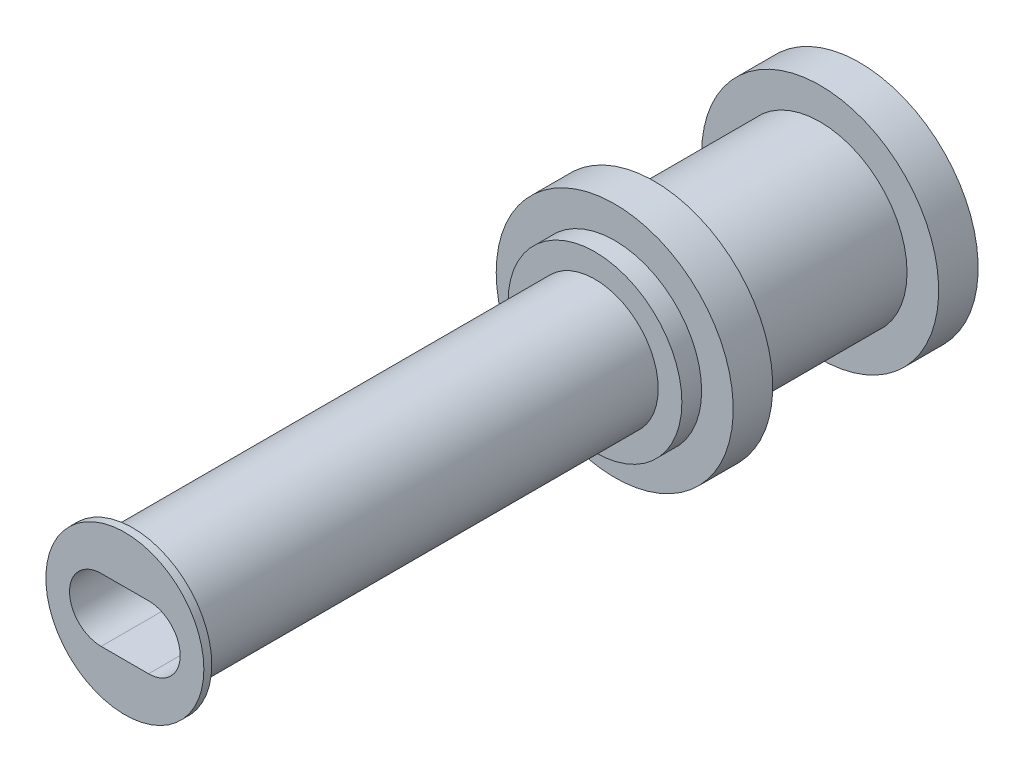
ISO-10303-21;
HEADER;
FILE_DESCRIPTION(('STEP AP214'),'2;1');
FILE_NAME('part.step','',(''),(''),'','','');
FILE_SCHEMA(('AUTOMOTIVE_DESIGN { 1 0 10303 214 1 1 1 1 }'));
ENDSEC;
DATA;
#1=APPLICATION_CONTEXT('core data for automotive mechanical design processes');
#2=APPLICATION_PROTOCOL_DEFINITION('international standard','automotive_design',2000,#1);
#3=PRODUCT_CONTEXT('',#1,'mechanical');
#4=PRODUCT('Part','Part','',(#3));
#5=PRODUCT_RELATED_PRODUCT_CATEGORY('part','',(#4));
#6=PRODUCT_DEFINITION_FORMATION('','',#4);
#7=PRODUCT_DEFINITION_CONTEXT('part definition',#1,'design');
#8=PRODUCT_DEFINITION('design','',#6,#7);
#9=PRODUCT_DEFINITION_SHAPE('','',#8);
#10=(LENGTH_UNIT() NAMED_UNIT(*) SI_UNIT(.MILLI.,.METRE.));
#11=(NAMED_UNIT(*) PLANE_ANGLE_UNIT() SI_UNIT($,.RADIAN.));
#12=(NAMED_UNIT(*) SI_UNIT($,.STERADIAN.) SOLID_ANGLE_UNIT());
#13=UNCERTAINTY_MEASURE_WITH_UNIT(LENGTH_MEASURE(1.E-05),#10,'distance_accuracy_value','');
#14=(GEOMETRIC_REPRESENTATION_CONTEXT(3) GLOBAL_UNCERTAINTY_ASSIGNED_CONTEXT((#13)) GLOBAL_UNIT_ASSIGNED_CONTEXT((#10,
#11,#12)) REPRESENTATION_CONTEXT('',''));
#15=CARTESIAN_POINT('',(0.,0.,0.));
#16=DIRECTION('',(0.,0.,1.));
#17=DIRECTION('',(1.,0.,0.));
#18=AXIS2_PLACEMENT_3D('',#15,#16,#17);
#19=CARTESIAN_POINT('',(7.874,0.,23.622));
#20=DIRECTION('',(0.,0.,-1.));
#21=DIRECTION('',(-1.,0.,0.));
#22=AXIS2_PLACEMENT_3D('',#19,#20,#21);
#23=CYLINDRICAL_SURFACE('',#22,2.032);
#24=CARTESIAN_POINT('',(7.874,0.,8.509));
#25=DIRECTION('',(0.,0.,1.));
#26=DIRECTION('',(1.,0.,0.));
#27=AXIS2_PLACEMENT_3D('',#24,#25,#26);
#28=CIRCLE('',#27,2.032);
#29=CARTESIAN_POINT('',(9.906,0.,8.509));
#30=VERTEX_POINT('',#29);
#31=EDGE_CURVE('E194',#30,#30,#28,.T.);
#32=ORIENTED_EDGE('',*,*,#31,.T.);
#33=EDGE_LOOP('',(#32));
#34=FACE_BOUND('',#33,.T.);
#35=CARTESIAN_POINT('',(7.874,0.,23.368));
#36=DIRECTION('',(0.,0.,1.));
#37=DIRECTION('',(1.,0.,0.));
#38=AXIS2_PLACEMENT_3D('',#35,#36,#37);
#39=CIRCLE('',#38,2.032);
#40=CARTESIAN_POINT('',(9.906,0.,23.368));
#41=VERTEX_POINT('',#40);
#42=EDGE_CURVE('E11',#41,#41,#39,.T.);
#43=ORIENTED_EDGE('',*,*,#42,.F.);
#44=EDGE_LOOP('',(#43));
#45=FACE_BOUND('',#44,.T.);
#46=ADVANCED_FACE('F38',(#34,#45),#23,.T.);
#47=CARTESIAN_POINT('',(7.874,0.,8.509));
#48=DIRECTION('',(0.,0.,1.));
#49=DIRECTION('',(1.,0.,0.));
#50=AXIS2_PLACEMENT_3D('',#47,#48,#49);
#51=PLANE('',#50);
#52=CARTESIAN_POINT('',(7.874,0.,8.509));
#53=DIRECTION('',(0.,0.,1.));
#54=DIRECTION('',(1.,0.,0.));
#55=AXIS2_PLACEMENT_3D('',#52,#53,#54);
#56=CIRCLE('',#55,2.794);
#57=CARTESIAN_POINT('',(10.668,0.,8.509));
#58=VERTEX_POINT('',#57);
#59=EDGE_CURVE('E199',#58,#58,#56,.T.);
#60=ORIENTED_EDGE('',*,*,#59,.T.);
#61=EDGE_LOOP('',(#60));
#62=FACE_BOUND('',#61,.T.);
#63=ORIENTED_EDGE('',*,*,#31,.F.);
#64=EDGE_LOOP('',(#63));
#65=FACE_BOUND('',#64,.T.);
#66=ADVANCED_FACE('F305',(#62,#65),#51,.T.);
#67=CARTESIAN_POINT('',(7.874,-6.28822135623731,7.874));
#68=DIRECTION('',(0.,0.,-1.));
#69=DIRECTION('',(1.,0.,0.));
#70=AXIS2_PLACEMENT_3D('',#67,#68,#69);
#71=PLANE('',#70);
#72=CARTESIAN_POINT('',(7.874,0.,7.874));
#73=DIRECTION('',(0.,0.,-1.));
#74=DIRECTION('',(-1.,0.,0.));
#75=AXIS2_PLACEMENT_3D('',#72,#73,#74);
#76=CIRCLE('',#75,3.81);
#77=CARTESIAN_POINT('',(4.064,0.,7.874));
#78=VERTEX_POINT('',#77);
#79=EDGE_CURVE('E202',#78,#78,#76,.T.);
#80=ORIENTED_EDGE('',*,*,#79,.F.);
#81=EDGE_LOOP('',(#80));
#82=FACE_BOUND('',#81,.T.);
#83=CARTESIAN_POINT('',(7.874,0.,7.874));
#84=DIRECTION('',(0.,0.,-1.));
#85=DIRECTION('',(-1.,0.,0.));
#86=AXIS2_PLACEMENT_3D('',#83,#84,#85);
#87=CIRCLE('',#86,2.794);
#88=CARTESIAN_POINT('',(5.08,0.,7.874));
#89=VERTEX_POINT('',#88);
#90=EDGE_CURVE('E46',#89,#89,#87,.F.);
#91=ORIENTED_EDGE('',*,*,#90,.F.);
#92=EDGE_LOOP('',(#91));
#93=FACE_BOUND('',#92,.T.);
#94=ADVANCED_FACE('F303',(#82,#93),#71,.F.);
#95=CARTESIAN_POINT('',(7.874,0.,3.937));
#96=DIRECTION('',(0.,0.,-1.));
#97=DIRECTION('',(-1.,0.,0.));
#98=AXIS2_PLACEMENT_3D('',#95,#96,#97);
#99=CYLINDRICAL_SURFACE('',#98,2.794);
#100=CARTESIAN_POINT('',(7.874,0.,1.27));
#101=DIRECTION('',(0.,0.,-1.));
#102=DIRECTION('',(-1.,0.,0.));
#103=AXIS2_PLACEMENT_3D('',#100,#101,#102);
#104=CIRCLE('',#103,2.794);
#105=CARTESIAN_POINT('',(5.08,0.,1.27));
#106=VERTEX_POINT('',#105);
#107=EDGE_CURVE('E293',#106,#106,#104,.T.);
#108=ORIENTED_EDGE('',*,*,#107,.F.);
#109=EDGE_LOOP('',(#108));
#110=FACE_BOUND('',#109,.T.);
#111=CARTESIAN_POINT('',(7.874,0.,6.604));
#112=DIRECTION('',(0.,0.,1.));
#113=DIRECTION('',(1.,0.,0.));
#114=AXIS2_PLACEMENT_3D('',#111,#112,#113);
#115=CIRCLE('',#114,2.794);
#116=CARTESIAN_POINT('',(10.668,0.,6.604));
#117=VERTEX_POINT('',#116);
#118=EDGE_CURVE('E296',#117,#117,#115,.T.);
#119=ORIENTED_EDGE('',*,*,#118,.F.);
#120=EDGE_LOOP('',(#119));
#121=FACE_BOUND('',#120,.T.);
#122=ADVANCED_FACE('F40',(#110,#121),#99,.T.);
#123=CARTESIAN_POINT('',(7.874,-1.524,3.937));
#124=DIRECTION('',(0.,0.,-1.));
#125=DIRECTION('',(-1.,0.,0.));
#126=AXIS2_PLACEMENT_3D('',#123,#124,#125);
#127=CYLINDRICAL_SURFACE('',#126,0.762000000000002);
#128=CARTESIAN_POINT('',(7.874,-1.524,0.));
#129=DIRECTION('',(0.,0.,1.));
#130=DIRECTION('',(1.,0.,0.));
#131=AXIS2_PLACEMENT_3D('',#128,#129,#130);
#132=CIRCLE('',#131,0.762000000000002);
#133=CARTESIAN_POINT('',(7.112,-1.524,0.));
#134=VERTEX_POINT('',#133);
#135=CARTESIAN_POINT('',(8.636,-1.524,0.));
#136=VERTEX_POINT('',#135);
#137=EDGE_CURVE('E238',#134,#136,#132,.T.);
#138=ORIENTED_EDGE('',*,*,#137,.F.);
#139=DIRECTION('',(0.,0.,-1.));
#140=VECTOR('',#139,1.);
#141=CARTESIAN_POINT('',(7.112,-1.524,3.937));
#142=LINE('',#141,#140);
#143=CARTESIAN_POINT('',(7.112,-1.524,7.874));
#144=VERTEX_POINT('',#143);
#145=EDGE_CURVE('E291',#144,#134,#142,.T.);
#146=ORIENTED_EDGE('',*,*,#145,.F.);
#147=CARTESIAN_POINT('',(7.874,-1.524,7.874));
#148=DIRECTION('',(0.,0.,1.));
#149=DIRECTION('',(1.,0.,0.));
#150=AXIS2_PLACEMENT_3D('',#147,#148,#149);
#151=CIRCLE('',#150,0.762000000000002);
#152=CARTESIAN_POINT('',(8.636,-1.524,7.874));
#153=VERTEX_POINT('',#152);
#154=EDGE_CURVE('E206',#144,#153,#151,.T.);
#155=ORIENTED_EDGE('',*,*,#154,.T.);
#156=DIRECTION('',(0.,0.,-1.));
#157=VECTOR('',#156,1.);
#158=CARTESIAN_POINT('',(8.636,-1.524,3.937));
#159=LINE('',#158,#157);
#160=EDGE_CURVE('E61',#153,#136,#159,.T.);
#161=ORIENTED_EDGE('',*,*,#160,.T.);
#162=EDGE_LOOP('',(#138,#146,#155,#161));
#163=FACE_BOUND('',#162,.T.);
#164=ADVANCED_FACE('F312',(#163),#127,.F.);
#165=CARTESIAN_POINT('',(7.112,-6.28822135623731,3.937));
#166=DIRECTION('',(1.,0.,0.));
#167=DIRECTION('',(0.,0.,-1.));
#168=AXIS2_PLACEMENT_3D('',#165,#166,#167);
#169=PLANE('',#168);
#170=DIRECTION('',(0.,-1.,0.));
#171=VECTOR('',#170,1.);
#172=CARTESIAN_POINT('',(7.112,-6.28822135623731,0.));
#173=LINE('',#172,#171);
#174=CARTESIAN_POINT('',(7.112,-0.762000000000001,0.));
#175=VERTEX_POINT('',#174);
#176=EDGE_CURVE('E244',#175,#134,#173,.T.);
#177=ORIENTED_EDGE('',*,*,#176,.F.);
#178=DIRECTION('',(0.,0.,-1.));
#179=VECTOR('',#178,1.);
#180=CARTESIAN_POINT('',(7.112,-0.762000000000001,3.937));
#181=LINE('',#180,#179);
#182=CARTESIAN_POINT('',(7.112,-0.762000000000001,7.874));
#183=VERTEX_POINT('',#182);
#184=EDGE_CURVE('E289',#183,#175,#181,.T.);
#185=ORIENTED_EDGE('',*,*,#184,.F.);
#186=DIRECTION('',(0.,-1.,0.));
#187=VECTOR('',#186,1.);
#188=CARTESIAN_POINT('',(7.112,-6.28822135623731,7.874));
#189=LINE('',#188,#187);
#190=EDGE_CURVE('E231',#183,#144,#189,.T.);
#191=ORIENTED_EDGE('',*,*,#190,.T.);
#192=ORIENTED_EDGE('',*,*,#145,.T.);
#193=EDGE_LOOP('',(#177,#185,#191,#192));
#194=FACE_BOUND('',#193,.T.);
#195=ADVANCED_FACE('F468',(#194),#169,.T.);
#196=CARTESIAN_POINT('',(7.874,-0.762000000000001,3.937));
#197=DIRECTION('',(0.,1.,0.));
#198=DIRECTION('',(-1.,0.,0.));
#199=AXIS2_PLACEMENT_3D('',#196,#197,#198);
#200=PLANE('',#199);
#201=DIRECTION('',(1.,0.,0.));
#202=VECTOR('',#201,1.);
#203=CARTESIAN_POINT('',(7.874,-0.762000000000001,0.));
#204=LINE('',#203,#202);
#205=CARTESIAN_POINT('',(6.35,-0.762000000000002,0.));
#206=VERTEX_POINT('',#205);
#207=EDGE_CURVE('E247',#206,#175,#204,.T.);
#208=ORIENTED_EDGE('',*,*,#207,.F.);
#209=DIRECTION('',(0.,0.,-1.));
#210=VECTOR('',#209,1.);
#211=CARTESIAN_POINT('',(6.35,-0.762000000000002,3.937));
#212=LINE('',#211,#210);
#213=CARTESIAN_POINT('',(6.35,-0.762000000000002,7.874));
#214=VERTEX_POINT('',#213);
#215=EDGE_CURVE('E287',#214,#206,#212,.T.);
#216=ORIENTED_EDGE('',*,*,#215,.F.);
#217=DIRECTION('',(1.,0.,0.));
#218=VECTOR('',#217,1.);
#219=CARTESIAN_POINT('',(7.874,-0.762000000000001,7.874));
#220=LINE('',#219,#218);
#221=EDGE_CURVE('E218',#214,#183,#220,.T.);
#222=ORIENTED_EDGE('',*,*,#221,.T.);
#223=ORIENTED_EDGE('',*,*,#184,.T.);
#224=EDGE_LOOP('',(#208,#216,#222,#223));
#225=FACE_BOUND('',#224,.T.);
#226=ADVANCED_FACE('F478',(#225),#200,.T.);
#227=CARTESIAN_POINT('',(6.35,0.,3.937));
#228=DIRECTION('',(0.,0.,-1.));
#229=DIRECTION('',(-1.,0.,0.));
#230=AXIS2_PLACEMENT_3D('',#227,#228,#229);
#231=CYLINDRICAL_SURFACE('',#230,0.762000000000002);
#232=CARTESIAN_POINT('',(6.35,0.,0.));
#233=DIRECTION('',(0.,0.,1.));
#234=DIRECTION('',(1.,0.,0.));
#235=AXIS2_PLACEMENT_3D('',#232,#233,#234);
#236=CIRCLE('',#235,0.762000000000002);
#237=CARTESIAN_POINT('',(6.35,0.762000000000001,0.));
#238=VERTEX_POINT('',#237);
#239=EDGE_CURVE('E251',#238,#206,#236,.T.);
#240=ORIENTED_EDGE('',*,*,#239,.F.);
#241=DIRECTION('',(0.,0.,-1.));
#242=VECTOR('',#241,1.);
#243=CARTESIAN_POINT('',(6.35,0.762000000000001,3.937));
#244=LINE('',#243,#242);
#245=CARTESIAN_POINT('',(6.35,0.762000000000001,7.874));
#246=VERTEX_POINT('',#245);
#247=EDGE_CURVE('E285',#246,#238,#244,.T.);
#248=ORIENTED_EDGE('',*,*,#247,.F.);
#249=CARTESIAN_POINT('',(6.35,0.,7.874));
#250=DIRECTION('',(0.,0.,1.));
#251=DIRECTION('',(1.,0.,0.));
#252=AXIS2_PLACEMENT_3D('',#249,#250,#251);
#253=CIRCLE('',#252,0.762000000000002);
#254=EDGE_CURVE('E232',#246,#214,#253,.T.);
#255=ORIENTED_EDGE('',*,*,#254,.T.);
#256=ORIENTED_EDGE('',*,*,#215,.T.);
#257=EDGE_LOOP('',(#240,#248,#255,#256));
#258=FACE_BOUND('',#257,.T.);
#259=ADVANCED_FACE('F490',(#258),#231,.F.);
#260=CARTESIAN_POINT('',(7.874,0.762000000000001,3.937));
#261=DIRECTION('',(0.,1.,0.));
#262=DIRECTION('',(-1.,0.,0.));
#263=AXIS2_PLACEMENT_3D('',#260,#261,#262);
#264=PLANE('',#263);
#265=DIRECTION('',(1.,0.,0.));
#266=VECTOR('',#265,1.);
#267=CARTESIAN_POINT('',(7.874,0.762000000000001,0.));
#268=LINE('',#267,#266);
#269=CARTESIAN_POINT('',(7.112,0.762000000000001,0.));
#270=VERTEX_POINT('',#269);
#271=EDGE_CURVE('E255',#238,#270,#268,.T.);
#272=ORIENTED_EDGE('',*,*,#271,.T.);
#273=DIRECTION('',(0.,0.,-1.));
#274=VECTOR('',#273,1.);
#275=CARTESIAN_POINT('',(7.112,0.762000000000001,3.937));
#276=LINE('',#275,#274);
#277=CARTESIAN_POINT('',(7.112,0.762000000000001,7.874));
#278=VERTEX_POINT('',#277);
#279=EDGE_CURVE('E283',#278,#270,#276,.T.);
#280=ORIENTED_EDGE('',*,*,#279,.F.);
#281=DIRECTION('',(1.,0.,0.));
#282=VECTOR('',#281,1.);
#283=CARTESIAN_POINT('',(7.874,0.762000000000001,7.874));
#284=LINE('',#283,#282);
#285=EDGE_CURVE('E224',#246,#278,#284,.T.);
#286=ORIENTED_EDGE('',*,*,#285,.F.);
#287=ORIENTED_EDGE('',*,*,#247,.T.);
#288=EDGE_LOOP('',(#272,#280,#286,#287));
#289=FACE_BOUND('',#288,.T.);
#290=ADVANCED_FACE('F502',(#289),#264,.F.);
#291=CARTESIAN_POINT('',(7.112,1.524,0.));
#292=VERTEX_POINT('',#291);
#293=EDGE_CURVE('E248',#292,#270,#173,.T.);
#294=ORIENTED_EDGE('',*,*,#293,.F.);
#295=DIRECTION('',(0.,0.,-1.));
#296=VECTOR('',#295,1.);
#297=CARTESIAN_POINT('',(7.112,1.524,3.937));
#298=LINE('',#297,#296);
#299=CARTESIAN_POINT('',(7.112,1.524,7.874));
#300=VERTEX_POINT('',#299);
#301=EDGE_CURVE('E281',#300,#292,#298,.T.);
#302=ORIENTED_EDGE('',*,*,#301,.F.);
#303=EDGE_CURVE('E228',#300,#278,#189,.T.);
#304=ORIENTED_EDGE('',*,*,#303,.T.);
#305=ORIENTED_EDGE('',*,*,#279,.T.);
#306=EDGE_LOOP('',(#294,#302,#304,#305));
#307=FACE_BOUND('',#306,.T.);
#308=ADVANCED_FACE('F481',(#307),#169,.T.);
#309=CARTESIAN_POINT('',(7.874,1.524,3.937));
#310=DIRECTION('',(0.,0.,-1.));
#311=DIRECTION('',(-1.,0.,0.));
#312=AXIS2_PLACEMENT_3D('',#309,#310,#311);
#313=CYLINDRICAL_SURFACE('',#312,0.762000000000002);
#314=CARTESIAN_POINT('',(7.874,1.524,0.));
#315=DIRECTION('',(0.,0.,1.));
#316=DIRECTION('',(1.,0.,0.));
#317=AXIS2_PLACEMENT_3D('',#314,#315,#316);
#318=CIRCLE('',#317,0.762000000000002);
#319=CARTESIAN_POINT('',(8.636,1.524,0.));
#320=VERTEX_POINT('',#319);
#321=EDGE_CURVE('E259',#320,#292,#318,.T.);
#322=ORIENTED_EDGE('',*,*,#321,.F.);
#323=DIRECTION('',(0.,0.,-1.));
#324=VECTOR('',#323,1.);
#325=CARTESIAN_POINT('',(8.636,1.524,3.937));
#326=LINE('',#325,#324);
#327=CARTESIAN_POINT('',(8.636,1.524,7.874));
#328=VERTEX_POINT('',#327);
#329=EDGE_CURVE('E279',#328,#320,#326,.T.);
#330=ORIENTED_EDGE('',*,*,#329,.F.);
#331=CARTESIAN_POINT('',(7.874,1.524,7.874));
#332=DIRECTION('',(0.,0.,1.));
#333=DIRECTION('',(1.,0.,0.));
#334=AXIS2_PLACEMENT_3D('',#331,#332,#333);
#335=CIRCLE('',#334,0.762000000000002);
#336=EDGE_CURVE('E225',#328,#300,#335,.T.);
#337=ORIENTED_EDGE('',*,*,#336,.T.);
#338=ORIENTED_EDGE('',*,*,#301,.T.);
#339=EDGE_LOOP('',(#322,#330,#337,#338));
#340=FACE_BOUND('',#339,.T.);
#341=ADVANCED_FACE('F524',(#340),#313,.F.);
#342=CARTESIAN_POINT('',(8.636,-6.28822135623731,3.937));
#343=DIRECTION('',(1.,0.,0.));
#344=DIRECTION('',(0.,0.,-1.));
#345=AXIS2_PLACEMENT_3D('',#342,#343,#344);
#346=PLANE('',#345);
#347=DIRECTION('',(0.,-1.,0.));
#348=VECTOR('',#347,1.);
#349=CARTESIAN_POINT('',(8.636,-6.28822135623731,0.));
#350=LINE('',#349,#348);
#351=CARTESIAN_POINT('',(8.636,0.762000000000001,0.));
#352=VERTEX_POINT('',#351);
#353=EDGE_CURVE('E262',#320,#352,#350,.T.);
#354=ORIENTED_EDGE('',*,*,#353,.T.);
#355=DIRECTION('',(0.,0.,-1.));
#356=VECTOR('',#355,1.);
#357=CARTESIAN_POINT('',(8.636,0.762000000000001,3.937));
#358=LINE('',#357,#356);
#359=CARTESIAN_POINT('',(8.636,0.762000000000001,7.874));
#360=VERTEX_POINT('',#359);
#361=EDGE_CURVE('E276',#360,#352,#358,.T.);
#362=ORIENTED_EDGE('',*,*,#361,.F.);
#363=DIRECTION('',(0.,-1.,0.));
#364=VECTOR('',#363,1.);
#365=CARTESIAN_POINT('',(8.636,-6.28822135623731,7.874));
#366=LINE('',#365,#364);
#367=EDGE_CURVE('E214',#328,#360,#366,.T.);
#368=ORIENTED_EDGE('',*,*,#367,.F.);
#369=ORIENTED_EDGE('',*,*,#329,.T.);
#370=EDGE_LOOP('',(#354,#362,#368,#369));
#371=FACE_BOUND('',#370,.T.);
#372=ADVANCED_FACE('F534',(#371),#346,.F.);
#373=CARTESIAN_POINT('',(9.398,0.762000000000002,0.));
#374=VERTEX_POINT('',#373);
#375=EDGE_CURVE('E258',#352,#374,#268,.T.);
#376=ORIENTED_EDGE('',*,*,#375,.T.);
#377=DIRECTION('',(0.,0.,-1.));
#378=VECTOR('',#377,1.);
#379=CARTESIAN_POINT('',(9.398,0.762000000000002,3.937));
#380=LINE('',#379,#378);
#381=CARTESIAN_POINT('',(9.398,0.762000000000002,7.874));
#382=VERTEX_POINT('',#381);
#383=EDGE_CURVE('E274',#382,#374,#380,.T.);
#384=ORIENTED_EDGE('',*,*,#383,.F.);
#385=EDGE_CURVE('E221',#360,#382,#284,.T.);
#386=ORIENTED_EDGE('',*,*,#385,.F.);
#387=ORIENTED_EDGE('',*,*,#361,.T.);
#388=EDGE_LOOP('',(#376,#384,#386,#387));
#389=FACE_BOUND('',#388,.T.);
#390=ADVANCED_FACE('F515',(#389),#264,.F.);
#391=CARTESIAN_POINT('',(9.398,0.,3.937));
#392=DIRECTION('',(0.,0.,-1.));
#393=DIRECTION('',(-1.,0.,0.));
#394=AXIS2_PLACEMENT_3D('',#391,#392,#393);
#395=CYLINDRICAL_SURFACE('',#394,0.762000000000002);
#396=CARTESIAN_POINT('',(9.398,0.,0.));
#397=DIRECTION('',(0.,0.,1.));
#398=DIRECTION('',(1.,0.,0.));
#399=AXIS2_PLACEMENT_3D('',#396,#397,#398);
#400=CIRCLE('',#399,0.762000000000002);
#401=CARTESIAN_POINT('',(9.398,-0.762000000000001,0.));
#402=VERTEX_POINT('',#401);
#403=EDGE_CURVE('E266',#402,#374,#400,.T.);
#404=ORIENTED_EDGE('',*,*,#403,.F.);
#405=DIRECTION('',(0.,0.,-1.));
#406=VECTOR('',#405,1.);
#407=CARTESIAN_POINT('',(9.398,-0.762000000000001,3.937));
#408=LINE('',#407,#406);
#409=CARTESIAN_POINT('',(9.398,-0.762000000000001,7.874));
#410=VERTEX_POINT('',#409);
#411=EDGE_CURVE('E272',#410,#402,#408,.T.);
#412=ORIENTED_EDGE('',*,*,#411,.F.);
#413=CARTESIAN_POINT('',(9.398,0.,7.874));
#414=DIRECTION('',(0.,0.,1.));
#415=DIRECTION('',(1.,0.,0.));
#416=AXIS2_PLACEMENT_3D('',#413,#414,#415);
#417=CIRCLE('',#416,0.762000000000002);
#418=EDGE_CURVE('E217',#410,#382,#417,.T.);
#419=ORIENTED_EDGE('',*,*,#418,.T.);
#420=ORIENTED_EDGE('',*,*,#383,.T.);
#421=EDGE_LOOP('',(#404,#412,#419,#420));
#422=FACE_BOUND('',#421,.T.);
#423=ADVANCED_FACE('F556',(#422),#395,.F.);
#424=CARTESIAN_POINT('',(8.636,-0.762000000000001,0.));
#425=VERTEX_POINT('',#424);
#426=EDGE_CURVE('E252',#425,#402,#204,.T.);
#427=ORIENTED_EDGE('',*,*,#426,.F.);
#428=DIRECTION('',(0.,0.,-1.));
#429=VECTOR('',#428,1.);
#430=CARTESIAN_POINT('',(8.636,-0.762000000000001,3.937));
#431=LINE('',#430,#429);
#432=CARTESIAN_POINT('',(8.636,-0.762000000000001,7.874));
#433=VERTEX_POINT('',#432);
#434=EDGE_CURVE('E270',#433,#425,#431,.T.);
#435=ORIENTED_EDGE('',*,*,#434,.F.);
#436=EDGE_CURVE('E213',#433,#410,#220,.T.);
#437=ORIENTED_EDGE('',*,*,#436,.T.);
#438=ORIENTED_EDGE('',*,*,#411,.T.);
#439=EDGE_LOOP('',(#427,#435,#437,#438));
#440=FACE_BOUND('',#439,.T.);
#441=ADVANCED_FACE('F493',(#440),#200,.T.);
#442=EDGE_CURVE('E265',#425,#136,#350,.T.);
#443=ORIENTED_EDGE('',*,*,#442,.T.);
#444=ORIENTED_EDGE('',*,*,#160,.F.);
#445=EDGE_CURVE('E210',#433,#153,#366,.T.);
#446=ORIENTED_EDGE('',*,*,#445,.F.);
#447=ORIENTED_EDGE('',*,*,#434,.T.);
#448=EDGE_LOOP('',(#443,#444,#446,#447));
#449=FACE_BOUND('',#448,.T.);
#450=ADVANCED_FACE('F547',(#449),#346,.F.);
#451=CARTESIAN_POINT('',(7.874,-6.28822135623731,0.));
#452=DIRECTION('',(0.,0.,1.));
#453=DIRECTION('',(1.,0.,0.));
#454=AXIS2_PLACEMENT_3D('',#451,#452,#453);
#455=PLANE('',#454);
#456=ORIENTED_EDGE('',*,*,#137,.T.);
#457=ORIENTED_EDGE('',*,*,#442,.F.);
#458=ORIENTED_EDGE('',*,*,#426,.T.);
#459=ORIENTED_EDGE('',*,*,#403,.T.);
#460=ORIENTED_EDGE('',*,*,#375,.F.);
#461=ORIENTED_EDGE('',*,*,#353,.F.);
#462=ORIENTED_EDGE('',*,*,#321,.T.);
#463=ORIENTED_EDGE('',*,*,#293,.T.);
#464=ORIENTED_EDGE('',*,*,#271,.F.);
#465=ORIENTED_EDGE('',*,*,#239,.T.);
#466=ORIENTED_EDGE('',*,*,#207,.T.);
#467=ORIENTED_EDGE('',*,*,#176,.T.);
#468=EDGE_LOOP('',(#456,#457,#458,#459,#460,#461,#462,#463,#464,#465,#466,#467));
#469=FACE_BOUND('',#468,.T.);
#470=CARTESIAN_POINT('',(7.874,0.,0.));
#471=DIRECTION('',(0.,0.,-1.));
#472=DIRECTION('',(-1.,0.,0.));
#473=AXIS2_PLACEMENT_3D('',#470,#471,#472);
#474=CIRCLE('',#473,3.81);
#475=CARTESIAN_POINT('',(4.064,0.,0.));
#476=VERTEX_POINT('',#475);
#477=EDGE_CURVE('E239',#476,#476,#474,.T.);
#478=ORIENTED_EDGE('',*,*,#477,.T.);
#479=EDGE_LOOP('',(#478));
#480=FACE_BOUND('',#479,.T.);
#481=ADVANCED_FACE('F583',(#469,#480),#455,.F.);
#482=CARTESIAN_POINT('',(7.874,0.,1.27));
#483=DIRECTION('',(0.,0.,-1.));
#484=DIRECTION('',(-1.,0.,0.));
#485=AXIS2_PLACEMENT_3D('',#482,#483,#484);
#486=CYLINDRICAL_SURFACE('',#485,3.81);
#487=CARTESIAN_POINT('',(7.874,0.,1.27));
#488=DIRECTION('',(0.,0.,-1.));
#489=DIRECTION('',(-1.,0.,0.));
#490=AXIS2_PLACEMENT_3D('',#487,#488,#489);
#491=CIRCLE('',#490,3.81);
#492=CARTESIAN_POINT('',(4.064,0.,1.27));
#493=VERTEX_POINT('',#492);
#494=EDGE_CURVE('E235',#493,#493,#491,.T.);
#495=ORIENTED_EDGE('',*,*,#494,.T.);
#496=EDGE_LOOP('',(#495));
#497=FACE_BOUND('',#496,.T.);
#498=ORIENTED_EDGE('',*,*,#477,.F.);
#499=EDGE_LOOP('',(#498));
#500=FACE_BOUND('',#499,.T.);
#501=ADVANCED_FACE('F594',(#497,#500),#486,.T.);
#502=CARTESIAN_POINT('',(7.874,0.,1.27));
#503=DIRECTION('',(0.,0.,-1.));
#504=DIRECTION('',(-1.,0.,0.));
#505=AXIS2_PLACEMENT_3D('',#502,#503,#504);
#506=PLANE('',#505);
#507=ORIENTED_EDGE('',*,*,#107,.T.);
#508=EDGE_LOOP('',(#507));
#509=FACE_BOUND('',#508,.T.);
#510=ORIENTED_EDGE('',*,*,#494,.F.);
#511=EDGE_LOOP('',(#510));
#512=FACE_BOUND('',#511,.T.);
#513=ADVANCED_FACE('F340',(#509,#512),#506,.F.);
#514=CARTESIAN_POINT('',(7.874,0.,6.604));
#515=DIRECTION('',(0.,0.,1.));
#516=DIRECTION('',(-1.,0.,0.));
#517=AXIS2_PLACEMENT_3D('',#514,#515,#516);
#518=PLANE('',#517);
#519=CARTESIAN_POINT('',(7.874,0.,6.604));
#520=DIRECTION('',(0.,0.,-1.));
#521=DIRECTION('',(-1.,0.,0.));
#522=AXIS2_PLACEMENT_3D('',#519,#520,#521);
#523=CIRCLE('',#522,3.81);
#524=CARTESIAN_POINT('',(4.064,0.,6.604));
#525=VERTEX_POINT('',#524);
#526=EDGE_CURVE('E203',#525,#525,#523,.T.);
#527=ORIENTED_EDGE('',*,*,#526,.T.);
#528=EDGE_LOOP('',(#527));
#529=FACE_BOUND('',#528,.T.);
#530=ORIENTED_EDGE('',*,*,#118,.T.);
#531=EDGE_LOOP('',(#530));
#532=FACE_BOUND('',#531,.T.);
#533=ADVANCED_FACE('F338',(#529,#532),#518,.F.);
#534=CARTESIAN_POINT('',(7.874,0.,6.604));
#535=DIRECTION('',(0.,0.,1.));
#536=DIRECTION('',(1.,0.,0.));
#537=AXIS2_PLACEMENT_3D('',#534,#535,#536);
#538=CYLINDRICAL_SURFACE('',#537,3.81);
#539=ORIENTED_EDGE('',*,*,#526,.F.);
#540=EDGE_LOOP('',(#539));
#541=FACE_BOUND('',#540,.T.);
#542=ORIENTED_EDGE('',*,*,#79,.T.);
#543=EDGE_LOOP('',(#542));
#544=FACE_BOUND('',#543,.T.);
#545=ADVANCED_FACE('F336',(#541,#544),#538,.T.);
#546=CARTESIAN_POINT('',(7.874,0.,8.509));
#547=DIRECTION('',(0.,0.,-1.));
#548=DIRECTION('',(-1.,0.,0.));
#549=AXIS2_PLACEMENT_3D('',#546,#547,#548);
#550=CYLINDRICAL_SURFACE('',#549,2.794);
#551=ORIENTED_EDGE('',*,*,#59,.F.);
#552=EDGE_LOOP('',(#551));
#553=FACE_BOUND('',#552,.T.);
#554=ORIENTED_EDGE('',*,*,#90,.T.);
#555=EDGE_LOOP('',(#554));
#556=FACE_BOUND('',#555,.T.);
#557=ADVANCED_FACE('F301',(#553,#556),#550,.T.);
#558=CARTESIAN_POINT('',(7.874,0.,7.874));
#559=DIRECTION('',(0.,0.,1.));
#560=DIRECTION('',(1.,0.,0.));
#561=AXIS2_PLACEMENT_3D('',#558,#559,#560);
#562=PLANE('',#561);
#563=ORIENTED_EDGE('',*,*,#154,.F.);
#564=ORIENTED_EDGE('',*,*,#190,.F.);
#565=ORIENTED_EDGE('',*,*,#221,.F.);
#566=ORIENTED_EDGE('',*,*,#254,.F.);
#567=ORIENTED_EDGE('',*,*,#285,.T.);
#568=ORIENTED_EDGE('',*,*,#303,.F.);
#569=ORIENTED_EDGE('',*,*,#336,.F.);
#570=ORIENTED_EDGE('',*,*,#367,.T.);
#571=ORIENTED_EDGE('',*,*,#385,.T.);
#572=ORIENTED_EDGE('',*,*,#418,.F.);
#573=ORIENTED_EDGE('',*,*,#436,.F.);
#574=ORIENTED_EDGE('',*,*,#445,.T.);
#575=EDGE_LOOP('',(#563,#564,#565,#566,#567,#568,#569,#570,#571,#572,#573,#574));
#576=FACE_BOUND('',#575,.T.);
#577=ADVANCED_FACE('F329',(#576),#562,.F.);
#578=CARTESIAN_POINT('',(7.874,0.,23.368));
#579=DIRECTION('',(0.,0.,1.));
#580=DIRECTION('',(1.,0.,0.));
#581=AXIS2_PLACEMENT_3D('',#578,#579,#580);
#582=CYLINDRICAL_SURFACE('',#581,2.54);
#583=CARTESIAN_POINT('',(7.874,0.,23.368));
#584=DIRECTION('',(0.,0.,1.));
#585=DIRECTION('',(1.,0.,0.));
#586=AXIS2_PLACEMENT_3D('',#583,#584,#585);
#587=CIRCLE('',#586,2.54);
#588=CARTESIAN_POINT('',(10.414,0.,23.368));
#589=VERTEX_POINT('',#588);
#590=EDGE_CURVE('E191',#589,#589,#587,.T.);
#591=ORIENTED_EDGE('',*,*,#590,.T.);
#592=EDGE_LOOP('',(#591));
#593=FACE_BOUND('',#592,.T.);
#594=CARTESIAN_POINT('',(7.874,0.,23.622));
#595=DIRECTION('',(0.,0.,1.));
#596=DIRECTION('',(1.,0.,0.));
#597=AXIS2_PLACEMENT_3D('',#594,#595,#596);
#598=CIRCLE('',#597,2.54);
#599=CARTESIAN_POINT('',(10.414,0.,23.622));
#600=VERTEX_POINT('',#599);
#601=EDGE_CURVE('E187',#600,#600,#598,.T.);
#602=ORIENTED_EDGE('',*,*,#601,.F.);
#603=EDGE_LOOP('',(#602));
#604=FACE_BOUND('',#603,.T.);
#605=ADVANCED_FACE('F332',(#593,#604),#582,.T.);
#606=CARTESIAN_POINT('',(7.874,0.,23.368));
#607=DIRECTION('',(0.,0.,1.));
#608=DIRECTION('',(1.,0.,0.));
#609=AXIS2_PLACEMENT_3D('',#606,#607,#608);
#610=PLANE('',#609);
#611=ORIENTED_EDGE('',*,*,#42,.T.);
#612=EDGE_LOOP('',(#611));
#613=FACE_BOUND('',#612,.T.);
#614=ORIENTED_EDGE('',*,*,#590,.F.);
#615=EDGE_LOOP('',(#614));
#616=FACE_BOUND('',#615,.T.);
#617=ADVANCED_FACE('F370',(#613,#616),#610,.F.);
#618=CARTESIAN_POINT('',(7.874,0.,23.622));
#619=DIRECTION('',(0.,0.,1.));
#620=DIRECTION('',(1.,0.,0.));
#621=AXIS2_PLACEMENT_3D('',#618,#619,#620);
#622=PLANE('',#621);
#623=CARTESIAN_POINT('',(8.636,0.,23.622));
#624=DIRECTION('',(0.,0.,1.));
#625=DIRECTION('',(1.,0.,0.));
#626=AXIS2_PLACEMENT_3D('',#623,#624,#625);
#627=CIRCLE('',#626,1.016);
#628=CARTESIAN_POINT('',(8.636,-1.016,23.622));
#629=VERTEX_POINT('',#628);
#630=CARTESIAN_POINT('',(8.636,1.016,23.622));
#631=VERTEX_POINT('',#630);
#632=EDGE_CURVE('E53',#629,#631,#627,.T.);
#633=ORIENTED_EDGE('',*,*,#632,.F.);
#634=DIRECTION('',(1.,0.,0.));
#635=VECTOR('',#634,1.);
#636=CARTESIAN_POINT('',(8.636,-1.016,23.622));
#637=LINE('',#636,#635);
#638=CARTESIAN_POINT('',(7.112,-1.016,23.622));
#639=VERTEX_POINT('',#638);
#640=EDGE_CURVE('E172',#639,#629,#637,.T.);
#641=ORIENTED_EDGE('',*,*,#640,.F.);
#642=CARTESIAN_POINT('',(7.112,0.,23.622));
#643=DIRECTION('',(0.,0.,1.));
#644=DIRECTION('',(1.,0.,0.));
#645=AXIS2_PLACEMENT_3D('',#642,#643,#644);
#646=CIRCLE('',#645,1.016);
#647=CARTESIAN_POINT('',(7.112,1.016,23.622));
#648=VERTEX_POINT('',#647);
#649=EDGE_CURVE('E175',#648,#639,#646,.T.);
#650=ORIENTED_EDGE('',*,*,#649,.F.);
#651=DIRECTION('',(-1.,0.,0.));
#652=VECTOR('',#651,1.);
#653=CARTESIAN_POINT('',(8.636,1.016,23.622));
#654=LINE('',#653,#652);
#655=EDGE_CURVE('E181',#631,#648,#654,.T.);
#656=ORIENTED_EDGE('',*,*,#655,.F.);
#657=EDGE_LOOP('',(#633,#641,#650,#656));
#658=FACE_BOUND('',#657,.T.);
#659=ORIENTED_EDGE('',*,*,#601,.T.);
#660=EDGE_LOOP('',(#659));
#661=FACE_BOUND('',#660,.T.);
#662=ADVANCED_FACE('F326',(#658,#661),#622,.T.);
#663=CARTESIAN_POINT('',(8.636,0.,8.382));
#664=DIRECTION('',(0.,0.,1.));
#665=DIRECTION('',(1.,0.,0.));
#666=AXIS2_PLACEMENT_3D('',#663,#664,#665);
#667=CYLINDRICAL_SURFACE('',#666,1.016);
#668=ORIENTED_EDGE('',*,*,#632,.T.);
#669=DIRECTION('',(0.,0.,1.));
#670=VECTOR('',#669,1.);
#671=CARTESIAN_POINT('',(8.636,1.016,8.382));
#672=LINE('',#671,#670);
#673=CARTESIAN_POINT('',(8.636,1.016,8.382));
#674=VERTEX_POINT('',#673);
#675=EDGE_CURVE('E150',#674,#631,#672,.T.);
#676=ORIENTED_EDGE('',*,*,#675,.F.);
#677=CARTESIAN_POINT('',(8.636,0.,8.382));
#678=DIRECTION('',(0.,0.,1.));
#679=DIRECTION('',(1.,0.,0.));
#680=AXIS2_PLACEMENT_3D('',#677,#678,#679);
#681=CIRCLE('',#680,1.016);
#682=CARTESIAN_POINT('',(8.636,-1.016,8.382));
#683=VERTEX_POINT('',#682);
#684=EDGE_CURVE('E154',#683,#674,#681,.T.);
#685=ORIENTED_EDGE('',*,*,#684,.F.);
#686=DIRECTION('',(0.,0.,1.));
#687=VECTOR('',#686,1.);
#688=CARTESIAN_POINT('',(8.636,-1.016,8.382));
#689=LINE('',#688,#687);
#690=EDGE_CURVE('E185',#683,#629,#689,.T.);
#691=ORIENTED_EDGE('',*,*,#690,.T.);
#692=EDGE_LOOP('',(#668,#676,#685,#691));
#693=FACE_BOUND('',#692,.T.);
#694=ADVANCED_FACE('F152',(#693),#667,.F.);
#695=CARTESIAN_POINT('',(8.636,-1.016,8.382));
#696=DIRECTION('',(0.,-1.,0.));
#697=DIRECTION('',(1.,0.,0.));
#698=AXIS2_PLACEMENT_3D('',#695,#696,#697);
#699=PLANE('',#698);
#700=ORIENTED_EDGE('',*,*,#640,.T.);
#701=ORIENTED_EDGE('',*,*,#690,.F.);
#702=DIRECTION('',(1.,0.,0.));
#703=VECTOR('',#702,1.);
#704=CARTESIAN_POINT('',(8.636,-1.016,8.382));
#705=LINE('',#704,#703);
#706=CARTESIAN_POINT('',(7.112,-1.016,8.382));
#707=VERTEX_POINT('',#706);
#708=EDGE_CURVE('E160',#707,#683,#705,.T.);
#709=ORIENTED_EDGE('',*,*,#708,.F.);
#710=DIRECTION('',(0.,0.,1.));
#711=VECTOR('',#710,1.);
#712=CARTESIAN_POINT('',(7.112,-1.016,8.382));
#713=LINE('',#712,#711);
#714=EDGE_CURVE('E188',#707,#639,#713,.T.);
#715=ORIENTED_EDGE('',*,*,#714,.T.);
#716=EDGE_LOOP('',(#700,#701,#709,#715));
#717=FACE_BOUND('',#716,.T.);
#718=ADVANCED_FACE('F390',(#717),#699,.F.);
#719=CARTESIAN_POINT('',(7.112,0.,8.382));
#720=DIRECTION('',(0.,0.,1.));
#721=DIRECTION('',(1.,0.,0.));
#722=AXIS2_PLACEMENT_3D('',#719,#720,#721);
#723=CYLINDRICAL_SURFACE('',#722,1.016);
#724=ORIENTED_EDGE('',*,*,#649,.T.);
#725=ORIENTED_EDGE('',*,*,#714,.F.);
#726=CARTESIAN_POINT('',(7.112,0.,8.382));
#727=DIRECTION('',(0.,0.,1.));
#728=DIRECTION('',(1.,0.,0.));
#729=AXIS2_PLACEMENT_3D('',#726,#727,#728);
#730=CIRCLE('',#729,1.016);
#731=CARTESIAN_POINT('',(7.112,1.016,8.382));
#732=VERTEX_POINT('',#731);
#733=EDGE_CURVE('E168',#732,#707,#730,.T.);
#734=ORIENTED_EDGE('',*,*,#733,.F.);
#735=DIRECTION('',(0.,0.,1.));
#736=VECTOR('',#735,1.);
#737=CARTESIAN_POINT('',(7.112,1.016,8.382));
#738=LINE('',#737,#736);
#739=EDGE_CURVE('E159',#732,#648,#738,.T.);
#740=ORIENTED_EDGE('',*,*,#739,.T.);
#741=EDGE_LOOP('',(#724,#725,#734,#740));
#742=FACE_BOUND('',#741,.T.);
#743=ADVANCED_FACE('F397',(#742),#723,.F.);
#744=CARTESIAN_POINT('',(8.636,1.016,8.382));
#745=DIRECTION('',(0.,1.,0.));
#746=DIRECTION('',(-1.,0.,0.));
#747=AXIS2_PLACEMENT_3D('',#744,#745,#746);
#748=PLANE('',#747);
#749=ORIENTED_EDGE('',*,*,#655,.T.);
#750=ORIENTED_EDGE('',*,*,#739,.F.);
#751=DIRECTION('',(-1.,0.,0.));
#752=VECTOR('',#751,1.);
#753=CARTESIAN_POINT('',(8.636,1.016,8.382));
#754=LINE('',#753,#752);
#755=EDGE_CURVE('E163',#674,#732,#754,.T.);
#756=ORIENTED_EDGE('',*,*,#755,.F.);
#757=ORIENTED_EDGE('',*,*,#675,.T.);
#758=EDGE_LOOP('',(#749,#750,#756,#757));
#759=FACE_BOUND('',#758,.T.);
#760=ADVANCED_FACE('F164',(#759),#748,.F.);
#761=CARTESIAN_POINT('',(8.636,0.,8.382));
#762=DIRECTION('',(0.,0.,1.));
#763=DIRECTION('',(1.,0.,0.));
#764=AXIS2_PLACEMENT_3D('',#761,#762,#763);
#765=PLANE('',#764);
#766=ORIENTED_EDGE('',*,*,#684,.T.);
#767=ORIENTED_EDGE('',*,*,#755,.T.);
#768=ORIENTED_EDGE('',*,*,#733,.T.);
#769=ORIENTED_EDGE('',*,*,#708,.T.);
#770=EDGE_LOOP('',(#766,#767,#768,#769));
#771=FACE_BOUND('',#770,.T.);
#772=ADVANCED_FACE('F170',(#771),#765,.T.);
#773=CLOSED_SHELL('',(#46,#66,#94,#122,#164,#195,#226,#259,#290,#308,#341,#372,#390,#423,#441,
#450,#481,#501,#513,#533,#545,#557,#577,#605,#617,#662,#694,#718,#743,#760,#772));
#774=MANIFOLD_SOLID_BREP('B2',#773);
#775=ADVANCED_BREP_SHAPE_REPRESENTATION('',(#18,#774),#14);
#776=SHAPE_DEFINITION_REPRESENTATION(#9,#775);
ENDSEC;
END-ISO-10303-21;
